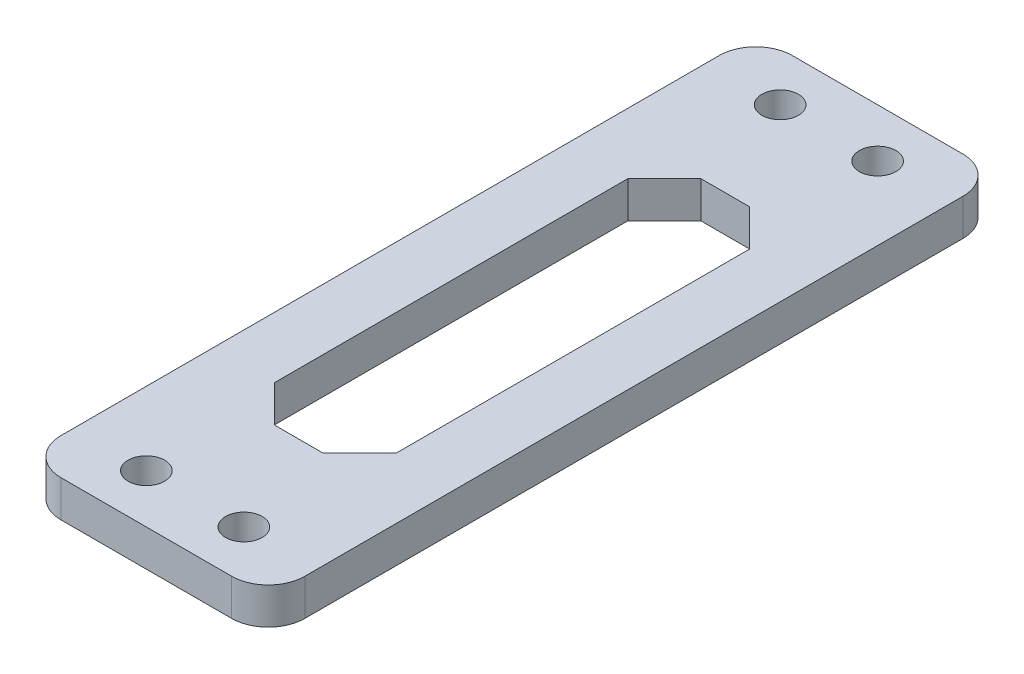
ISO-10303-21;
HEADER;
FILE_DESCRIPTION(('STEP AP214'),'2;1');
FILE_NAME('part.step','',(''),(''),'','','');
FILE_SCHEMA(('AUTOMOTIVE_DESIGN { 1 0 10303 214 1 1 1 1 }'));
ENDSEC;
DATA;
#1=APPLICATION_CONTEXT('core data for automotive mechanical design processes');
#2=APPLICATION_PROTOCOL_DEFINITION('international standard','automotive_design',2000,#1);
#3=PRODUCT_CONTEXT('',#1,'mechanical');
#4=PRODUCT('Part','Part','',(#3));
#5=PRODUCT_RELATED_PRODUCT_CATEGORY('part','',(#4));
#6=PRODUCT_DEFINITION_FORMATION('','',#4);
#7=PRODUCT_DEFINITION_CONTEXT('part definition',#1,'design');
#8=PRODUCT_DEFINITION('design','',#6,#7);
#9=PRODUCT_DEFINITION_SHAPE('','',#8);
#10=(LENGTH_UNIT() NAMED_UNIT(*) SI_UNIT(.MILLI.,.METRE.));
#11=(NAMED_UNIT(*) PLANE_ANGLE_UNIT() SI_UNIT($,.RADIAN.));
#12=(NAMED_UNIT(*) SI_UNIT($,.STERADIAN.) SOLID_ANGLE_UNIT());
#13=UNCERTAINTY_MEASURE_WITH_UNIT(LENGTH_MEASURE(1.E-05),#10,'distance_accuracy_value','');
#14=(GEOMETRIC_REPRESENTATION_CONTEXT(3) GLOBAL_UNCERTAINTY_ASSIGNED_CONTEXT((#13)) GLOBAL_UNIT_ASSIGNED_CONTEXT((#10,
#11,#12)) REPRESENTATION_CONTEXT('',''));
#15=CARTESIAN_POINT('',(0.,0.,0.));
#16=DIRECTION('',(0.,0.,1.));
#17=DIRECTION('',(1.,0.,0.));
#18=AXIS2_PLACEMENT_3D('',#15,#16,#17);
#19=CARTESIAN_POINT('',(0.,3.,0.));
#20=DIRECTION('',(0.,-1.,0.));
#21=DIRECTION('',(0.,0.,-1.));
#22=AXIS2_PLACEMENT_3D('',#19,#20,#21);
#23=PLANE('',#22);
#24=CARTESIAN_POINT('',(-4.,3.,26.));
#25=DIRECTION('',(0.,1.,0.));
#26=DIRECTION('',(0.,0.,-1.));
#27=AXIS2_PLACEMENT_3D('',#24,#25,#26);
#28=CIRCLE('',#27,1.5);
#29=CARTESIAN_POINT('',(-4.,3.,24.5));
#30=VERTEX_POINT('',#29);
#31=EDGE_CURVE('E333',#30,#30,#28,.T.);
#32=ORIENTED_EDGE('',*,*,#31,.F.);
#33=EDGE_LOOP('',(#32));
#34=FACE_BOUND('',#33,.T.);
#35=CARTESIAN_POINT('',(4.,3.,26.));
#36=DIRECTION('',(0.,1.,0.));
#37=DIRECTION('',(0.,0.,1.));
#38=AXIS2_PLACEMENT_3D('',#35,#36,#37);
#39=CIRCLE('',#38,1.5);
#40=CARTESIAN_POINT('',(4.,3.,27.5));
#41=VERTEX_POINT('',#40);
#42=EDGE_CURVE('E325',#41,#41,#39,.T.);
#43=ORIENTED_EDGE('',*,*,#42,.F.);
#44=EDGE_LOOP('',(#43));
#45=FACE_BOUND('',#44,.T.);
#46=CARTESIAN_POINT('',(4.,3.,-26.));
#47=DIRECTION('',(0.,1.,0.));
#48=DIRECTION('',(0.,0.,-1.));
#49=AXIS2_PLACEMENT_3D('',#46,#47,#48);
#50=CIRCLE('',#49,1.5);
#51=CARTESIAN_POINT('',(4.,3.,-27.5));
#52=VERTEX_POINT('',#51);
#53=EDGE_CURVE('E317',#52,#52,#50,.T.);
#54=ORIENTED_EDGE('',*,*,#53,.F.);
#55=EDGE_LOOP('',(#54));
#56=FACE_BOUND('',#55,.T.);
#57=CARTESIAN_POINT('',(-4.,3.,-26.));
#58=DIRECTION('',(0.,1.,0.));
#59=DIRECTION('',(0.,0.,1.));
#60=AXIS2_PLACEMENT_3D('',#57,#58,#59);
#61=CIRCLE('',#60,1.5);
#62=CARTESIAN_POINT('',(-4.,3.,-24.5));
#63=VERTEX_POINT('',#62);
#64=EDGE_CURVE('E302',#63,#63,#61,.T.);
#65=ORIENTED_EDGE('',*,*,#64,.F.);
#66=EDGE_LOOP('',(#65));
#67=FACE_BOUND('',#66,.T.);
#68=DIRECTION('',(0.,0.,1.));
#69=VECTOR('',#68,1.);
#70=CARTESIAN_POINT('',(-10.,3.,30.));
#71=LINE('',#70,#69);
#72=CARTESIAN_POINT('',(-10.,3.,-27.));
#73=VERTEX_POINT('',#72);
#74=CARTESIAN_POINT('',(-10.,3.,27.));
#75=VERTEX_POINT('',#74);
#76=EDGE_CURVE('E194',#73,#75,#71,.T.);
#77=ORIENTED_EDGE('',*,*,#76,.T.);
#78=CARTESIAN_POINT('',(-7.,3.,27.));
#79=DIRECTION('',(0.,-1.,0.));
#80=DIRECTION('',(0.,0.,-1.));
#81=AXIS2_PLACEMENT_3D('',#78,#79,#80);
#82=CIRCLE('',#81,3.);
#83=CARTESIAN_POINT('',(-7.,3.,30.));
#84=VERTEX_POINT('',#83);
#85=EDGE_CURVE('E272',#75,#84,#82,.F.);
#86=ORIENTED_EDGE('',*,*,#85,.T.);
#87=DIRECTION('',(1.,0.,0.));
#88=VECTOR('',#87,1.);
#89=CARTESIAN_POINT('',(-10.,3.,30.));
#90=LINE('',#89,#88);
#91=CARTESIAN_POINT('',(7.,3.,30.));
#92=VERTEX_POINT('',#91);
#93=EDGE_CURVE('E187',#84,#92,#90,.T.);
#94=ORIENTED_EDGE('',*,*,#93,.T.);
#95=CARTESIAN_POINT('',(7.,3.,27.));
#96=DIRECTION('',(0.,-1.,0.));
#97=DIRECTION('',(0.,0.,-1.));
#98=AXIS2_PLACEMENT_3D('',#95,#96,#97);
#99=CIRCLE('',#98,3.);
#100=CARTESIAN_POINT('',(10.,3.,27.));
#101=VERTEX_POINT('',#100);
#102=EDGE_CURVE('E269',#92,#101,#99,.F.);
#103=ORIENTED_EDGE('',*,*,#102,.T.);
#104=DIRECTION('',(0.,0.,-1.));
#105=VECTOR('',#104,1.);
#106=CARTESIAN_POINT('',(10.,3.,30.));
#107=LINE('',#106,#105);
#108=CARTESIAN_POINT('',(10.,3.,-27.));
#109=VERTEX_POINT('',#108);
#110=EDGE_CURVE('E310',#101,#109,#107,.T.);
#111=ORIENTED_EDGE('',*,*,#110,.T.);
#112=CARTESIAN_POINT('',(7.,3.,-27.));
#113=DIRECTION('',(0.,-1.,0.));
#114=DIRECTION('',(0.,0.,-1.));
#115=AXIS2_PLACEMENT_3D('',#112,#113,#114);
#116=CIRCLE('',#115,3.);
#117=CARTESIAN_POINT('',(7.,3.,-30.));
#118=VERTEX_POINT('',#117);
#119=EDGE_CURVE('E66',#109,#118,#116,.F.);
#120=ORIENTED_EDGE('',*,*,#119,.T.);
#121=DIRECTION('',(-1.,0.,0.));
#122=VECTOR('',#121,1.);
#123=CARTESIAN_POINT('',(-10.,3.,-30.));
#124=LINE('',#123,#122);
#125=CARTESIAN_POINT('',(-7.,3.,-30.));
#126=VERTEX_POINT('',#125);
#127=EDGE_CURVE('E287',#118,#126,#124,.T.);
#128=ORIENTED_EDGE('',*,*,#127,.T.);
#129=CARTESIAN_POINT('',(-7.,3.,-27.));
#130=DIRECTION('',(0.,-1.,0.));
#131=DIRECTION('',(0.,0.,-1.));
#132=AXIS2_PLACEMENT_3D('',#129,#130,#131);
#133=CIRCLE('',#132,3.);
#134=EDGE_CURVE('E266',#126,#73,#133,.F.);
#135=ORIENTED_EDGE('',*,*,#134,.T.);
#136=EDGE_LOOP('',(#77,#86,#94,#103,#111,#120,#128,#135));
#137=FACE_BOUND('',#136,.T.);
#138=DIRECTION('',(0.,0.,-1.));
#139=VECTOR('',#138,1.);
#140=CARTESIAN_POINT('',(5.,3.,17.5));
#141=LINE('',#140,#139);
#142=CARTESIAN_POINT('',(5.,3.,14.5));
#143=VERTEX_POINT('',#142);
#144=CARTESIAN_POINT('',(5.,3.,-14.5));
#145=VERTEX_POINT('',#144);
#146=EDGE_CURVE('E182',#143,#145,#141,.T.);
#147=ORIENTED_EDGE('',*,*,#146,.F.);
#148=DIRECTION('',(0.707106781186552,0.,-0.707106781186543));
#149=VECTOR('',#148,1.);
#150=CARTESIAN_POINT('',(9.74999999999998,3.,9.75000000000009));
#151=LINE('',#150,#149);
#152=CARTESIAN_POINT('',(1.99999999999998,3.,17.5));
#153=VERTEX_POINT('',#152);
#154=EDGE_CURVE('E171',#143,#153,#151,.F.);
#155=ORIENTED_EDGE('',*,*,#154,.T.);
#156=DIRECTION('',(1.,0.,0.));
#157=VECTOR('',#156,1.);
#158=CARTESIAN_POINT('',(-5.,3.,17.5));
#159=LINE('',#158,#157);
#160=CARTESIAN_POINT('',(-2.00000000000001,3.,17.5));
#161=VERTEX_POINT('',#160);
#162=EDGE_CURVE('E341',#161,#153,#159,.T.);
#163=ORIENTED_EDGE('',*,*,#162,.F.);
#164=DIRECTION('',(0.707106781186543,0.,0.707106781186552));
#165=VECTOR('',#164,1.);
#166=CARTESIAN_POINT('',(-9.75000000000002,3.,9.74999999999989));
#167=LINE('',#166,#165);
#168=CARTESIAN_POINT('',(-5.,3.,14.5));
#169=VERTEX_POINT('',#168);
#170=EDGE_CURVE('E170',#161,#169,#167,.F.);
#171=ORIENTED_EDGE('',*,*,#170,.T.);
#172=DIRECTION('',(0.,0.,1.));
#173=VECTOR('',#172,1.);
#174=CARTESIAN_POINT('',(-5.,3.,17.5));
#175=LINE('',#174,#173);
#176=CARTESIAN_POINT('',(-5.,3.,-14.5));
#177=VERTEX_POINT('',#176);
#178=EDGE_CURVE('E357',#177,#169,#175,.T.);
#179=ORIENTED_EDGE('',*,*,#178,.F.);
#180=DIRECTION('',(-0.707106781186552,0.,0.707106781186543));
#181=VECTOR('',#180,1.);
#182=CARTESIAN_POINT('',(-9.74999999999997,3.,-9.75000000000011));
#183=LINE('',#182,#181);
#184=CARTESIAN_POINT('',(-1.99999999999997,3.,-17.5));
#185=VERTEX_POINT('',#184);
#186=EDGE_CURVE('E235',#177,#185,#183,.F.);
#187=ORIENTED_EDGE('',*,*,#186,.T.);
#188=DIRECTION('',(-1.,0.,0.));
#189=VECTOR('',#188,1.);
#190=CARTESIAN_POINT('',(-5.,3.,-17.5));
#191=LINE('',#190,#189);
#192=CARTESIAN_POINT('',(2.00000000000001,3.,-17.5));
#193=VERTEX_POINT('',#192);
#194=EDGE_CURVE('E361',#193,#185,#191,.T.);
#195=ORIENTED_EDGE('',*,*,#194,.F.);
#196=DIRECTION('',(-0.707106781186543,0.,-0.707106781186552));
#197=VECTOR('',#196,1.);
#198=CARTESIAN_POINT('',(9.75000000000002,3.,-9.74999999999988));
#199=LINE('',#198,#197);
#200=EDGE_CURVE('E229',#193,#145,#199,.F.);
#201=ORIENTED_EDGE('',*,*,#200,.T.);
#202=EDGE_LOOP('',(#147,#155,#163,#171,#179,#187,#195,#201));
#203=FACE_BOUND('',#202,.T.);
#204=ADVANCED_FACE('F45',(#34,#45,#56,#67,#137,#203),#23,.F.);
#205=CARTESIAN_POINT('',(0.,0.,0.));
#206=DIRECTION('',(0.,-1.,0.));
#207=DIRECTION('',(0.,0.,-1.));
#208=AXIS2_PLACEMENT_3D('',#205,#206,#207);
#209=PLANE('',#208);
#210=CARTESIAN_POINT('',(4.,0.,26.));
#211=DIRECTION('',(0.,1.,0.));
#212=DIRECTION('',(0.,0.,1.));
#213=AXIS2_PLACEMENT_3D('',#210,#211,#212);
#214=CIRCLE('',#213,1.5);
#215=CARTESIAN_POINT('',(4.,0.,27.5));
#216=VERTEX_POINT('',#215);
#217=EDGE_CURVE('E329',#216,#216,#214,.T.);
#218=ORIENTED_EDGE('',*,*,#217,.T.);
#219=EDGE_LOOP('',(#218));
#220=FACE_BOUND('',#219,.T.);
#221=CARTESIAN_POINT('',(-4.,0.,-26.));
#222=DIRECTION('',(0.,1.,0.));
#223=DIRECTION('',(0.,0.,1.));
#224=AXIS2_PLACEMENT_3D('',#221,#222,#223);
#225=CIRCLE('',#224,1.5);
#226=CARTESIAN_POINT('',(-4.,0.,-24.5));
#227=VERTEX_POINT('',#226);
#228=EDGE_CURVE('E313',#227,#227,#225,.T.);
#229=ORIENTED_EDGE('',*,*,#228,.T.);
#230=EDGE_LOOP('',(#229));
#231=FACE_BOUND('',#230,.T.);
#232=DIRECTION('',(1.,0.,0.));
#233=VECTOR('',#232,1.);
#234=CARTESIAN_POINT('',(-10.,0.,30.));
#235=LINE('',#234,#233);
#236=CARTESIAN_POINT('',(-7.,0.,30.));
#237=VERTEX_POINT('',#236);
#238=CARTESIAN_POINT('',(7.,0.,30.));
#239=VERTEX_POINT('',#238);
#240=EDGE_CURVE('E197',#237,#239,#235,.T.);
#241=ORIENTED_EDGE('',*,*,#240,.F.);
#242=CARTESIAN_POINT('',(-7.,0.,27.));
#243=DIRECTION('',(0.,-1.,0.));
#244=DIRECTION('',(0.,0.,-1.));
#245=AXIS2_PLACEMENT_3D('',#242,#243,#244);
#246=CIRCLE('',#245,3.);
#247=CARTESIAN_POINT('',(-10.,0.,27.));
#248=VERTEX_POINT('',#247);
#249=EDGE_CURVE('E254',#237,#248,#246,.T.);
#250=ORIENTED_EDGE('',*,*,#249,.T.);
#251=DIRECTION('',(0.,0.,1.));
#252=VECTOR('',#251,1.);
#253=CARTESIAN_POINT('',(-10.,0.,30.));
#254=LINE('',#253,#252);
#255=CARTESIAN_POINT('',(-10.,0.,-27.));
#256=VERTEX_POINT('',#255);
#257=EDGE_CURVE('E296',#256,#248,#254,.T.);
#258=ORIENTED_EDGE('',*,*,#257,.F.);
#259=CARTESIAN_POINT('',(-7.,0.,-27.));
#260=DIRECTION('',(0.,-1.,0.));
#261=DIRECTION('',(0.,0.,-1.));
#262=AXIS2_PLACEMENT_3D('',#259,#260,#261);
#263=CIRCLE('',#262,3.);
#264=CARTESIAN_POINT('',(-7.,0.,-30.));
#265=VERTEX_POINT('',#264);
#266=EDGE_CURVE('E248',#256,#265,#263,.T.);
#267=ORIENTED_EDGE('',*,*,#266,.T.);
#268=DIRECTION('',(-1.,0.,0.));
#269=VECTOR('',#268,1.);
#270=CARTESIAN_POINT('',(-10.,0.,-30.));
#271=LINE('',#270,#269);
#272=CARTESIAN_POINT('',(7.,0.,-30.));
#273=VERTEX_POINT('',#272);
#274=EDGE_CURVE('E286',#273,#265,#271,.T.);
#275=ORIENTED_EDGE('',*,*,#274,.F.);
#276=CARTESIAN_POINT('',(7.,0.,-27.));
#277=DIRECTION('',(0.,-1.,0.));
#278=DIRECTION('',(0.,0.,-1.));
#279=AXIS2_PLACEMENT_3D('',#276,#277,#278);
#280=CIRCLE('',#279,3.);
#281=CARTESIAN_POINT('',(10.,0.,-27.));
#282=VERTEX_POINT('',#281);
#283=EDGE_CURVE('E245',#273,#282,#280,.T.);
#284=ORIENTED_EDGE('',*,*,#283,.T.);
#285=DIRECTION('',(0.,0.,-1.));
#286=VECTOR('',#285,1.);
#287=CARTESIAN_POINT('',(10.,0.,30.));
#288=LINE('',#287,#286);
#289=CARTESIAN_POINT('',(10.,0.,27.));
#290=VERTEX_POINT('',#289);
#291=EDGE_CURVE('E297',#290,#282,#288,.T.);
#292=ORIENTED_EDGE('',*,*,#291,.F.);
#293=CARTESIAN_POINT('',(7.,0.,27.));
#294=DIRECTION('',(0.,-1.,0.));
#295=DIRECTION('',(0.,0.,-1.));
#296=AXIS2_PLACEMENT_3D('',#293,#294,#295);
#297=CIRCLE('',#296,3.);
#298=EDGE_CURVE('E251',#290,#239,#297,.T.);
#299=ORIENTED_EDGE('',*,*,#298,.T.);
#300=EDGE_LOOP('',(#241,#250,#258,#267,#275,#284,#292,#299));
#301=FACE_BOUND('',#300,.T.);
#302=CARTESIAN_POINT('',(4.,0.,-26.));
#303=DIRECTION('',(0.,1.,0.));
#304=DIRECTION('',(0.,0.,-1.));
#305=AXIS2_PLACEMENT_3D('',#302,#303,#304);
#306=CIRCLE('',#305,1.5);
#307=CARTESIAN_POINT('',(4.,0.,-27.5));
#308=VERTEX_POINT('',#307);
#309=EDGE_CURVE('E321',#308,#308,#306,.T.);
#310=ORIENTED_EDGE('',*,*,#309,.T.);
#311=EDGE_LOOP('',(#310));
#312=FACE_BOUND('',#311,.T.);
#313=CARTESIAN_POINT('',(-4.,0.,26.));
#314=DIRECTION('',(0.,1.,0.));
#315=DIRECTION('',(0.,0.,-1.));
#316=AXIS2_PLACEMENT_3D('',#313,#314,#315);
#317=CIRCLE('',#316,1.5);
#318=CARTESIAN_POINT('',(-4.,0.,24.5));
#319=VERTEX_POINT('',#318);
#320=EDGE_CURVE('E337',#319,#319,#317,.T.);
#321=ORIENTED_EDGE('',*,*,#320,.T.);
#322=EDGE_LOOP('',(#321));
#323=FACE_BOUND('',#322,.T.);
#324=DIRECTION('',(0.,0.,1.));
#325=VECTOR('',#324,1.);
#326=CARTESIAN_POINT('',(-5.,0.,17.5));
#327=LINE('',#326,#325);
#328=CARTESIAN_POINT('',(-5.,0.,-14.5));
#329=VERTEX_POINT('',#328);
#330=CARTESIAN_POINT('',(-5.,0.,14.5));
#331=VERTEX_POINT('',#330);
#332=EDGE_CURVE('E164',#329,#331,#327,.T.);
#333=ORIENTED_EDGE('',*,*,#332,.T.);
#334=DIRECTION('',(-0.707106781186543,0.,-0.707106781186552));
#335=VECTOR('',#334,1.);
#336=CARTESIAN_POINT('',(-5.,0.,14.5));
#337=LINE('',#336,#335);
#338=CARTESIAN_POINT('',(-2.00000000000001,0.,17.5));
#339=VERTEX_POINT('',#338);
#340=EDGE_CURVE('E159',#331,#339,#337,.F.);
#341=ORIENTED_EDGE('',*,*,#340,.T.);
#342=DIRECTION('',(1.,0.,0.));
#343=VECTOR('',#342,1.);
#344=CARTESIAN_POINT('',(-5.,0.,17.5));
#345=LINE('',#344,#343);
#346=CARTESIAN_POINT('',(1.99999999999998,0.,17.5));
#347=VERTEX_POINT('',#346);
#348=EDGE_CURVE('E162',#339,#347,#345,.T.);
#349=ORIENTED_EDGE('',*,*,#348,.T.);
#350=DIRECTION('',(-0.707106781186552,0.,0.707106781186543));
#351=VECTOR('',#350,1.);
#352=CARTESIAN_POINT('',(1.99999999999998,0.,17.5));
#353=LINE('',#352,#351);
#354=CARTESIAN_POINT('',(5.,0.,14.5));
#355=VERTEX_POINT('',#354);
#356=EDGE_CURVE('E219',#347,#355,#353,.F.);
#357=ORIENTED_EDGE('',*,*,#356,.T.);
#358=DIRECTION('',(0.,0.,-1.));
#359=VECTOR('',#358,1.);
#360=CARTESIAN_POINT('',(5.,0.,17.5));
#361=LINE('',#360,#359);
#362=CARTESIAN_POINT('',(5.,0.,-14.5));
#363=VERTEX_POINT('',#362);
#364=EDGE_CURVE('E351',#355,#363,#361,.T.);
#365=ORIENTED_EDGE('',*,*,#364,.T.);
#366=DIRECTION('',(0.707106781186543,0.,0.707106781186552));
#367=VECTOR('',#366,1.);
#368=CARTESIAN_POINT('',(5.,0.,-14.5));
#369=LINE('',#368,#367);
#370=CARTESIAN_POINT('',(2.00000000000001,0.,-17.5));
#371=VERTEX_POINT('',#370);
#372=EDGE_CURVE('E226',#363,#371,#369,.F.);
#373=ORIENTED_EDGE('',*,*,#372,.T.);
#374=DIRECTION('',(-1.,0.,0.));
#375=VECTOR('',#374,1.);
#376=CARTESIAN_POINT('',(-5.,0.,-17.5));
#377=LINE('',#376,#375);
#378=CARTESIAN_POINT('',(-1.99999999999997,0.,-17.5));
#379=VERTEX_POINT('',#378);
#380=EDGE_CURVE('E347',#371,#379,#377,.T.);
#381=ORIENTED_EDGE('',*,*,#380,.T.);
#382=DIRECTION('',(0.707106781186552,0.,-0.707106781186543));
#383=VECTOR('',#382,1.);
#384=CARTESIAN_POINT('',(-1.99999999999997,0.,-17.5));
#385=LINE('',#384,#383);
#386=EDGE_CURVE('E232',#379,#329,#385,.F.);
#387=ORIENTED_EDGE('',*,*,#386,.T.);
#388=EDGE_LOOP('',(#333,#341,#349,#357,#365,#373,#381,#387));
#389=FACE_BOUND('',#388,.T.);
#390=ADVANCED_FACE('F161',(#220,#231,#301,#312,#323,#389),#209,.T.);
#391=CARTESIAN_POINT('',(10.,3.,30.));
#392=DIRECTION('',(-1.,0.,0.));
#393=DIRECTION('',(0.,0.,1.));
#394=AXIS2_PLACEMENT_3D('',#391,#392,#393);
#395=PLANE('',#394);
#396=ORIENTED_EDGE('',*,*,#110,.F.);
#397=DIRECTION('',(0.,-1.,0.));
#398=VECTOR('',#397,1.);
#399=CARTESIAN_POINT('',(10.,3.,27.));
#400=LINE('',#399,#398);
#401=EDGE_CURVE('E278',#101,#290,#400,.T.);
#402=ORIENTED_EDGE('',*,*,#401,.T.);
#403=ORIENTED_EDGE('',*,*,#291,.T.);
#404=DIRECTION('',(0.,-1.,0.));
#405=VECTOR('',#404,1.);
#406=CARTESIAN_POINT('',(10.,3.,-27.));
#407=LINE('',#406,#405);
#408=EDGE_CURVE('E275',#282,#109,#407,.F.);
#409=ORIENTED_EDGE('',*,*,#408,.T.);
#410=EDGE_LOOP('',(#396,#402,#403,#409));
#411=FACE_BOUND('',#410,.T.);
#412=ADVANCED_FACE('F409',(#411),#395,.F.);
#413=CARTESIAN_POINT('',(-10.,3.,-30.));
#414=DIRECTION('',(0.,0.,1.));
#415=DIRECTION('',(1.,0.,0.));
#416=AXIS2_PLACEMENT_3D('',#413,#414,#415);
#417=PLANE('',#416);
#418=ORIENTED_EDGE('',*,*,#274,.T.);
#419=DIRECTION('',(0.,-1.,0.));
#420=VECTOR('',#419,1.);
#421=CARTESIAN_POINT('',(-7.,3.,-30.));
#422=LINE('',#421,#420);
#423=EDGE_CURVE('E11',#265,#126,#422,.F.);
#424=ORIENTED_EDGE('',*,*,#423,.T.);
#425=ORIENTED_EDGE('',*,*,#127,.F.);
#426=DIRECTION('',(0.,-1.,0.));
#427=VECTOR('',#426,1.);
#428=CARTESIAN_POINT('',(7.,3.,-30.));
#429=LINE('',#428,#427);
#430=EDGE_CURVE('E54',#118,#273,#429,.T.);
#431=ORIENTED_EDGE('',*,*,#430,.T.);
#432=EDGE_LOOP('',(#418,#424,#425,#431));
#433=FACE_BOUND('',#432,.T.);
#434=ADVANCED_FACE('F285',(#433),#417,.F.);
#435=CARTESIAN_POINT('',(-10.,3.,30.));
#436=DIRECTION('',(1.,0.,0.));
#437=DIRECTION('',(0.,0.,-1.));
#438=AXIS2_PLACEMENT_3D('',#435,#436,#437);
#439=PLANE('',#438);
#440=ORIENTED_EDGE('',*,*,#257,.T.);
#441=DIRECTION('',(0.,-1.,0.));
#442=VECTOR('',#441,1.);
#443=CARTESIAN_POINT('',(-10.,3.,27.));
#444=LINE('',#443,#442);
#445=EDGE_CURVE('E261',#248,#75,#444,.F.);
#446=ORIENTED_EDGE('',*,*,#445,.T.);
#447=ORIENTED_EDGE('',*,*,#76,.F.);
#448=DIRECTION('',(0.,-1.,0.));
#449=VECTOR('',#448,1.);
#450=CARTESIAN_POINT('',(-10.,3.,-27.));
#451=LINE('',#450,#449);
#452=EDGE_CURVE('E257',#73,#256,#451,.T.);
#453=ORIENTED_EDGE('',*,*,#452,.T.);
#454=EDGE_LOOP('',(#440,#446,#447,#453));
#455=FACE_BOUND('',#454,.T.);
#456=ADVANCED_FACE('F421',(#455),#439,.F.);
#457=CARTESIAN_POINT('',(-10.,3.,30.));
#458=DIRECTION('',(0.,0.,-1.));
#459=DIRECTION('',(-1.,0.,0.));
#460=AXIS2_PLACEMENT_3D('',#457,#458,#459);
#461=PLANE('',#460);
#462=ORIENTED_EDGE('',*,*,#93,.F.);
#463=DIRECTION('',(0.,-1.,0.));
#464=VECTOR('',#463,1.);
#465=CARTESIAN_POINT('',(-7.,3.,30.));
#466=LINE('',#465,#464);
#467=EDGE_CURVE('E241',#84,#237,#466,.T.);
#468=ORIENTED_EDGE('',*,*,#467,.T.);
#469=ORIENTED_EDGE('',*,*,#240,.T.);
#470=DIRECTION('',(0.,-1.,0.));
#471=VECTOR('',#470,1.);
#472=CARTESIAN_POINT('',(7.,3.,30.));
#473=LINE('',#472,#471);
#474=EDGE_CURVE('E238',#239,#92,#473,.F.);
#475=ORIENTED_EDGE('',*,*,#474,.T.);
#476=EDGE_LOOP('',(#462,#468,#469,#475));
#477=FACE_BOUND('',#476,.T.);
#478=ADVANCED_FACE('F418',(#477),#461,.F.);
#479=CARTESIAN_POINT('',(-4.,3.,-26.));
#480=DIRECTION('',(0.,-1.,0.));
#481=DIRECTION('',(0.,0.,-1.));
#482=AXIS2_PLACEMENT_3D('',#479,#480,#481);
#483=CYLINDRICAL_SURFACE('',#482,1.5);
#484=ORIENTED_EDGE('',*,*,#64,.T.);
#485=EDGE_LOOP('',(#484));
#486=FACE_BOUND('',#485,.T.);
#487=ORIENTED_EDGE('',*,*,#228,.F.);
#488=EDGE_LOOP('',(#487));
#489=FACE_BOUND('',#488,.T.);
#490=ADVANCED_FACE('F415',(#486,#489),#483,.F.);
#491=CARTESIAN_POINT('',(4.,3.,-26.));
#492=DIRECTION('',(0.,-1.,0.));
#493=DIRECTION('',(0.,0.,-1.));
#494=AXIS2_PLACEMENT_3D('',#491,#492,#493);
#495=CYLINDRICAL_SURFACE('',#494,1.5);
#496=ORIENTED_EDGE('',*,*,#53,.T.);
#497=EDGE_LOOP('',(#496));
#498=FACE_BOUND('',#497,.T.);
#499=ORIENTED_EDGE('',*,*,#309,.F.);
#500=EDGE_LOOP('',(#499));
#501=FACE_BOUND('',#500,.T.);
#502=ADVANCED_FACE('F579',(#498,#501),#495,.F.);
#503=CARTESIAN_POINT('',(4.,3.,26.));
#504=DIRECTION('',(0.,-1.,0.));
#505=DIRECTION('',(0.,0.,-1.));
#506=AXIS2_PLACEMENT_3D('',#503,#504,#505);
#507=CYLINDRICAL_SURFACE('',#506,1.5);
#508=ORIENTED_EDGE('',*,*,#42,.T.);
#509=EDGE_LOOP('',(#508));
#510=FACE_BOUND('',#509,.T.);
#511=ORIENTED_EDGE('',*,*,#217,.F.);
#512=EDGE_LOOP('',(#511));
#513=FACE_BOUND('',#512,.T.);
#514=ADVANCED_FACE('F569',(#510,#513),#507,.F.);
#515=CARTESIAN_POINT('',(-4.,3.,26.));
#516=DIRECTION('',(0.,-1.,0.));
#517=DIRECTION('',(0.,0.,-1.));
#518=AXIS2_PLACEMENT_3D('',#515,#516,#517);
#519=CYLINDRICAL_SURFACE('',#518,1.5);
#520=ORIENTED_EDGE('',*,*,#31,.T.);
#521=EDGE_LOOP('',(#520));
#522=FACE_BOUND('',#521,.T.);
#523=ORIENTED_EDGE('',*,*,#320,.F.);
#524=EDGE_LOOP('',(#523));
#525=FACE_BOUND('',#524,.T.);
#526=ADVANCED_FACE('F560',(#522,#525),#519,.F.);
#527=CARTESIAN_POINT('',(5.,3.,17.5));
#528=DIRECTION('',(-1.,0.,0.));
#529=DIRECTION('',(0.,0.,1.));
#530=AXIS2_PLACEMENT_3D('',#527,#528,#529);
#531=PLANE('',#530);
#532=ORIENTED_EDGE('',*,*,#364,.F.);
#533=DIRECTION('',(0.,1.,0.));
#534=VECTOR('',#533,1.);
#535=CARTESIAN_POINT('',(5.,3.,14.5));
#536=LINE('',#535,#534);
#537=EDGE_CURVE('E203',#355,#143,#536,.T.);
#538=ORIENTED_EDGE('',*,*,#537,.T.);
#539=ORIENTED_EDGE('',*,*,#146,.T.);
#540=DIRECTION('',(0.,-1.,0.));
#541=VECTOR('',#540,1.);
#542=CARTESIAN_POINT('',(5.,0.,-14.5));
#543=LINE('',#542,#541);
#544=EDGE_CURVE('E191',#145,#363,#543,.T.);
#545=ORIENTED_EDGE('',*,*,#544,.T.);
#546=EDGE_LOOP('',(#532,#538,#539,#545));
#547=FACE_BOUND('',#546,.T.);
#548=ADVANCED_FACE('F371',(#547),#531,.T.);
#549=CARTESIAN_POINT('',(-5.,3.,-17.5));
#550=DIRECTION('',(0.,0.,1.));
#551=DIRECTION('',(1.,0.,0.));
#552=AXIS2_PLACEMENT_3D('',#549,#550,#551);
#553=PLANE('',#552);
#554=ORIENTED_EDGE('',*,*,#380,.F.);
#555=DIRECTION('',(0.,1.,0.));
#556=VECTOR('',#555,1.);
#557=CARTESIAN_POINT('',(2.00000000000001,3.,-17.5));
#558=LINE('',#557,#556);
#559=EDGE_CURVE('E216',#371,#193,#558,.T.);
#560=ORIENTED_EDGE('',*,*,#559,.T.);
#561=ORIENTED_EDGE('',*,*,#194,.T.);
#562=DIRECTION('',(0.,-1.,0.));
#563=VECTOR('',#562,1.);
#564=CARTESIAN_POINT('',(-1.99999999999997,0.,-17.5));
#565=LINE('',#564,#563);
#566=EDGE_CURVE('E212',#185,#379,#565,.T.);
#567=ORIENTED_EDGE('',*,*,#566,.T.);
#568=EDGE_LOOP('',(#554,#560,#561,#567));
#569=FACE_BOUND('',#568,.T.);
#570=ADVANCED_FACE('F381',(#569),#553,.T.);
#571=CARTESIAN_POINT('',(-5.,3.,17.5));
#572=DIRECTION('',(1.,0.,0.));
#573=DIRECTION('',(0.,0.,-1.));
#574=AXIS2_PLACEMENT_3D('',#571,#572,#573);
#575=PLANE('',#574);
#576=ORIENTED_EDGE('',*,*,#178,.T.);
#577=DIRECTION('',(0.,-1.,0.));
#578=VECTOR('',#577,1.);
#579=CARTESIAN_POINT('',(-5.,0.,14.5));
#580=LINE('',#579,#578);
#581=EDGE_CURVE('E209',#169,#331,#580,.T.);
#582=ORIENTED_EDGE('',*,*,#581,.T.);
#583=ORIENTED_EDGE('',*,*,#332,.F.);
#584=DIRECTION('',(0.,1.,0.));
#585=VECTOR('',#584,1.);
#586=CARTESIAN_POINT('',(-5.,3.,-14.5));
#587=LINE('',#586,#585);
#588=EDGE_CURVE('E206',#329,#177,#587,.T.);
#589=ORIENTED_EDGE('',*,*,#588,.T.);
#590=EDGE_LOOP('',(#576,#582,#583,#589));
#591=FACE_BOUND('',#590,.T.);
#592=ADVANCED_FACE('F389',(#591),#575,.T.);
#593=CARTESIAN_POINT('',(-5.,3.,17.5));
#594=DIRECTION('',(0.,0.,-1.));
#595=DIRECTION('',(-1.,0.,0.));
#596=AXIS2_PLACEMENT_3D('',#593,#594,#595);
#597=PLANE('',#596);
#598=ORIENTED_EDGE('',*,*,#162,.T.);
#599=DIRECTION('',(0.,-1.,0.));
#600=VECTOR('',#599,1.);
#601=CARTESIAN_POINT('',(1.99999999999998,0.,17.5));
#602=LINE('',#601,#600);
#603=EDGE_CURVE('E180',#153,#347,#602,.T.);
#604=ORIENTED_EDGE('',*,*,#603,.T.);
#605=ORIENTED_EDGE('',*,*,#348,.F.);
#606=DIRECTION('',(0.,1.,0.));
#607=VECTOR('',#606,1.);
#608=CARTESIAN_POINT('',(-2.00000000000001,3.,17.5));
#609=LINE('',#608,#607);
#610=EDGE_CURVE('E177',#339,#161,#609,.T.);
#611=ORIENTED_EDGE('',*,*,#610,.T.);
#612=EDGE_LOOP('',(#598,#604,#605,#611));
#613=FACE_BOUND('',#612,.T.);
#614=ADVANCED_FACE('F176',(#613),#597,.T.);
#615=CARTESIAN_POINT('',(1.99999999999998,3.,17.5));
#616=DIRECTION('',(-0.707106781186543,0.,-0.707106781186552));
#617=DIRECTION('',(0.,1.,0.));
#618=AXIS2_PLACEMENT_3D('',#615,#616,#617);
#619=PLANE('',#618);
#620=ORIENTED_EDGE('',*,*,#154,.F.);
#621=ORIENTED_EDGE('',*,*,#537,.F.);
#622=ORIENTED_EDGE('',*,*,#356,.F.);
#623=ORIENTED_EDGE('',*,*,#603,.F.);
#624=EDGE_LOOP('',(#620,#621,#622,#623));
#625=FACE_BOUND('',#624,.T.);
#626=ADVANCED_FACE('F392',(#625),#619,.T.);
#627=CARTESIAN_POINT('',(-5.,3.,14.5));
#628=DIRECTION('',(0.707106781186552,0.,-0.707106781186543));
#629=DIRECTION('',(0.,1.,0.));
#630=AXIS2_PLACEMENT_3D('',#627,#628,#629);
#631=PLANE('',#630);
#632=ORIENTED_EDGE('',*,*,#170,.F.);
#633=ORIENTED_EDGE('',*,*,#610,.F.);
#634=ORIENTED_EDGE('',*,*,#340,.F.);
#635=ORIENTED_EDGE('',*,*,#581,.F.);
#636=EDGE_LOOP('',(#632,#633,#634,#635));
#637=FACE_BOUND('',#636,.T.);
#638=ADVANCED_FACE('F185',(#637),#631,.T.);
#639=CARTESIAN_POINT('',(5.,3.,-14.5));
#640=DIRECTION('',(-0.707106781186552,0.,0.707106781186543));
#641=DIRECTION('',(0.,1.,0.));
#642=AXIS2_PLACEMENT_3D('',#639,#640,#641);
#643=PLANE('',#642);
#644=ORIENTED_EDGE('',*,*,#200,.F.);
#645=ORIENTED_EDGE('',*,*,#559,.F.);
#646=ORIENTED_EDGE('',*,*,#372,.F.);
#647=ORIENTED_EDGE('',*,*,#544,.F.);
#648=EDGE_LOOP('',(#644,#645,#646,#647));
#649=FACE_BOUND('',#648,.T.);
#650=ADVANCED_FACE('F377',(#649),#643,.T.);
#651=CARTESIAN_POINT('',(-1.99999999999997,3.,-17.5));
#652=DIRECTION('',(0.707106781186543,0.,0.707106781186552));
#653=DIRECTION('',(0.,1.,0.));
#654=AXIS2_PLACEMENT_3D('',#651,#652,#653);
#655=PLANE('',#654);
#656=ORIENTED_EDGE('',*,*,#186,.F.);
#657=ORIENTED_EDGE('',*,*,#588,.F.);
#658=ORIENTED_EDGE('',*,*,#386,.F.);
#659=ORIENTED_EDGE('',*,*,#566,.F.);
#660=EDGE_LOOP('',(#656,#657,#658,#659));
#661=FACE_BOUND('',#660,.T.);
#662=ADVANCED_FACE('F386',(#661),#655,.T.);
#663=CARTESIAN_POINT('',(-7.,3.,27.));
#664=DIRECTION('',(0.,-1.,0.));
#665=DIRECTION('',(0.,0.,-1.));
#666=AXIS2_PLACEMENT_3D('',#663,#664,#665);
#667=CYLINDRICAL_SURFACE('',#666,3.);
#668=ORIENTED_EDGE('',*,*,#85,.F.);
#669=ORIENTED_EDGE('',*,*,#445,.F.);
#670=ORIENTED_EDGE('',*,*,#249,.F.);
#671=ORIENTED_EDGE('',*,*,#467,.F.);
#672=EDGE_LOOP('',(#668,#669,#670,#671));
#673=FACE_BOUND('',#672,.T.);
#674=ADVANCED_FACE('F444',(#673),#667,.T.);
#675=CARTESIAN_POINT('',(7.,3.,27.));
#676=DIRECTION('',(0.,-1.,0.));
#677=DIRECTION('',(0.,0.,-1.));
#678=AXIS2_PLACEMENT_3D('',#675,#676,#677);
#679=CYLINDRICAL_SURFACE('',#678,3.);
#680=ORIENTED_EDGE('',*,*,#102,.F.);
#681=ORIENTED_EDGE('',*,*,#474,.F.);
#682=ORIENTED_EDGE('',*,*,#298,.F.);
#683=ORIENTED_EDGE('',*,*,#401,.F.);
#684=EDGE_LOOP('',(#680,#681,#682,#683));
#685=FACE_BOUND('',#684,.T.);
#686=ADVANCED_FACE('F436',(#685),#679,.T.);
#687=CARTESIAN_POINT('',(-7.,3.,-27.));
#688=DIRECTION('',(0.,-1.,0.));
#689=DIRECTION('',(0.,0.,-1.));
#690=AXIS2_PLACEMENT_3D('',#687,#688,#689);
#691=CYLINDRICAL_SURFACE('',#690,3.);
#692=ORIENTED_EDGE('',*,*,#134,.F.);
#693=ORIENTED_EDGE('',*,*,#423,.F.);
#694=ORIENTED_EDGE('',*,*,#266,.F.);
#695=ORIENTED_EDGE('',*,*,#452,.F.);
#696=EDGE_LOOP('',(#692,#693,#694,#695));
#697=FACE_BOUND('',#696,.T.);
#698=ADVANCED_FACE('F450',(#697),#691,.T.);
#699=CARTESIAN_POINT('',(7.,3.,-27.));
#700=DIRECTION('',(0.,-1.,0.));
#701=DIRECTION('',(0.,0.,-1.));
#702=AXIS2_PLACEMENT_3D('',#699,#700,#701);
#703=CYLINDRICAL_SURFACE('',#702,3.);
#704=ORIENTED_EDGE('',*,*,#119,.F.);
#705=ORIENTED_EDGE('',*,*,#408,.F.);
#706=ORIENTED_EDGE('',*,*,#283,.F.);
#707=ORIENTED_EDGE('',*,*,#430,.F.);
#708=EDGE_LOOP('',(#704,#705,#706,#707));
#709=FACE_BOUND('',#708,.T.);
#710=ADVANCED_FACE('F47',(#709),#703,.T.);
#711=CLOSED_SHELL('',(#204,#390,#412,#434,#456,#478,#490,#502,#514,#526,#548,#570,#592,#614,
#626,#638,#650,#662,#674,#686,#698,#710));
#712=MANIFOLD_SOLID_BREP('B2',#711);
#713=ADVANCED_BREP_SHAPE_REPRESENTATION('',(#18,#712),#14);
#714=SHAPE_DEFINITION_REPRESENTATION(#9,#713);
ENDSEC;
END-ISO-10303-21;
